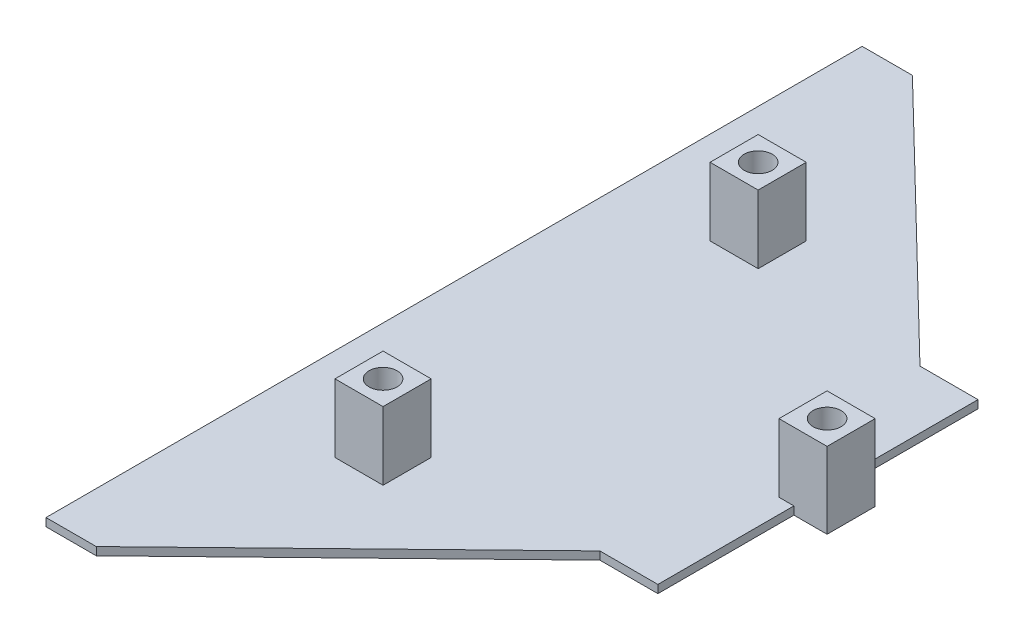
ISO-10303-21;
HEADER;
FILE_DESCRIPTION(('STEP AP214'),'2;1');
FILE_NAME('part.step','',(''),(''),'','','');
FILE_SCHEMA(('AUTOMOTIVE_DESIGN { 1 0 10303 214 1 1 1 1 }'));
ENDSEC;
DATA;
#1=APPLICATION_CONTEXT('core data for automotive mechanical design processes');
#2=APPLICATION_PROTOCOL_DEFINITION('international standard','automotive_design',2000,#1);
#3=PRODUCT_CONTEXT('',#1,'mechanical');
#4=PRODUCT('Part','Part','',(#3));
#5=PRODUCT_RELATED_PRODUCT_CATEGORY('part','',(#4));
#6=PRODUCT_DEFINITION_FORMATION('','',#4);
#7=PRODUCT_DEFINITION_CONTEXT('part definition',#1,'design');
#8=PRODUCT_DEFINITION('design','',#6,#7);
#9=PRODUCT_DEFINITION_SHAPE('','',#8);
#10=(LENGTH_UNIT() NAMED_UNIT(*) SI_UNIT(.MILLI.,.METRE.));
#11=(NAMED_UNIT(*) PLANE_ANGLE_UNIT() SI_UNIT($,.RADIAN.));
#12=(NAMED_UNIT(*) SI_UNIT($,.STERADIAN.) SOLID_ANGLE_UNIT());
#13=UNCERTAINTY_MEASURE_WITH_UNIT(LENGTH_MEASURE(1.E-05),#10,'distance_accuracy_value','');
#14=(GEOMETRIC_REPRESENTATION_CONTEXT(3) GLOBAL_UNCERTAINTY_ASSIGNED_CONTEXT((#13)) GLOBAL_UNIT_ASSIGNED_CONTEXT((#10,
#11,#12)) REPRESENTATION_CONTEXT('',''));
#15=CARTESIAN_POINT('',(0.,0.,0.));
#16=DIRECTION('',(0.,0.,1.));
#17=DIRECTION('',(1.,0.,0.));
#18=AXIS2_PLACEMENT_3D('',#15,#16,#17);
#19=CARTESIAN_POINT('',(45.4,1.,70.885));
#20=DIRECTION('',(-1.,0.,0.));
#21=DIRECTION('',(0.,0.,1.));
#22=AXIS2_PLACEMENT_3D('',#19,#20,#21);
#23=PLANE('',#22);
#24=DIRECTION('',(0.,1.,0.));
#25=VECTOR('',#24,1.);
#26=CARTESIAN_POINT('',(45.4,-7.28969135149082,47.915));
#27=LINE('',#26,#25);
#28=CARTESIAN_POINT('',(45.4,0.,47.915));
#29=VERTEX_POINT('',#28);
#30=CARTESIAN_POINT('',(45.4,1.,47.915));
#31=VERTEX_POINT('',#30);
#32=EDGE_CURVE('E183',#29,#31,#27,.T.);
#33=ORIENTED_EDGE('',*,*,#32,.F.);
#34=DIRECTION('',(0.,0.,-1.));
#35=VECTOR('',#34,1.);
#36=CARTESIAN_POINT('',(45.4,0.,70.885));
#37=LINE('',#36,#35);
#38=CARTESIAN_POINT('',(45.4,0.,30.945));
#39=VERTEX_POINT('',#38);
#40=EDGE_CURVE('E235',#29,#39,#37,.T.);
#41=ORIENTED_EDGE('',*,*,#40,.T.);
#42=DIRECTION('',(0.,-1.,0.));
#43=VECTOR('',#42,1.);
#44=CARTESIAN_POINT('',(45.4,1.,30.945));
#45=LINE('',#44,#43);
#46=CARTESIAN_POINT('',(45.4,1.,30.945));
#47=VERTEX_POINT('',#46);
#48=EDGE_CURVE('E202',#47,#39,#45,.T.);
#49=ORIENTED_EDGE('',*,*,#48,.F.);
#50=DIRECTION('',(0.,0.,-1.));
#51=VECTOR('',#50,1.);
#52=CARTESIAN_POINT('',(45.4,1.,70.885));
#53=LINE('',#52,#51);
#54=EDGE_CURVE('E203',#31,#47,#53,.T.);
#55=ORIENTED_EDGE('',*,*,#54,.F.);
#56=EDGE_LOOP('',(#33,#41,#49,#55));
#57=FACE_BOUND('',#56,.T.);
#58=ADVANCED_FACE('F39',(#57),#23,.F.);
#59=CARTESIAN_POINT('',(0.,1.,0.));
#60=DIRECTION('',(0.,1.,0.));
#61=DIRECTION('',(0.,0.,1.));
#62=AXIS2_PLACEMENT_3D('',#59,#60,#61);
#63=PLANE('',#62);
#64=CARTESIAN_POINT('',(46.54,1.,50.915));
#65=DIRECTION('',(0.,1.,0.));
#66=DIRECTION('',(0.,0.,1.));
#67=AXIS2_PLACEMENT_3D('',#64,#65,#66);
#68=CIRCLE('',#67,1.75);
#69=CARTESIAN_POINT('',(46.54,1.,52.665));
#70=VERTEX_POINT('',#69);
#71=EDGE_CURVE('E295',#70,#70,#68,.T.);
#72=ORIENTED_EDGE('',*,*,#71,.T.);
#73=EDGE_LOOP('',(#72));
#74=FACE_BOUND('',#73,.T.);
#75=ADVANCED_FACE('F429',(#74),#63,.T.);
#76=CARTESIAN_POINT('',(6.27,1.,0.));
#77=DIRECTION('',(0.,0.,1.));
#78=DIRECTION('',(1.,0.,0.));
#79=AXIS2_PLACEMENT_3D('',#76,#77,#78);
#80=PLANE('',#79);
#81=DIRECTION('',(-1.,0.,0.));
#82=VECTOR('',#81,1.);
#83=CARTESIAN_POINT('',(6.27,0.,0.));
#84=LINE('',#83,#82);
#85=CARTESIAN_POINT('',(6.27,0.,0.));
#86=VERTEX_POINT('',#85);
#87=CARTESIAN_POINT('',(0.,0.,0.));
#88=VERTEX_POINT('',#87);
#89=EDGE_CURVE('E219',#86,#88,#84,.T.);
#90=ORIENTED_EDGE('',*,*,#89,.T.);
#91=DIRECTION('',(0.,-1.,0.));
#92=VECTOR('',#91,1.);
#93=CARTESIAN_POINT('',(0.,1.,0.));
#94=LINE('',#93,#92);
#95=CARTESIAN_POINT('',(0.,1.,0.));
#96=VERTEX_POINT('',#95);
#97=EDGE_CURVE('E43',#96,#88,#94,.T.);
#98=ORIENTED_EDGE('',*,*,#97,.F.);
#99=DIRECTION('',(-1.,0.,0.));
#100=VECTOR('',#99,1.);
#101=CARTESIAN_POINT('',(6.27,1.,0.));
#102=LINE('',#101,#100);
#103=CARTESIAN_POINT('',(6.27,1.,0.));
#104=VERTEX_POINT('',#103);
#105=EDGE_CURVE('E238',#104,#96,#102,.T.);
#106=ORIENTED_EDGE('',*,*,#105,.F.);
#107=DIRECTION('',(0.,-1.,0.));
#108=VECTOR('',#107,1.);
#109=CARTESIAN_POINT('',(6.27,1.,0.));
#110=LINE('',#109,#108);
#111=EDGE_CURVE('E218',#104,#86,#110,.T.);
#112=ORIENTED_EDGE('',*,*,#111,.T.);
#113=EDGE_LOOP('',(#90,#98,#106,#112));
#114=FACE_BOUND('',#113,.T.);
#115=ADVANCED_FACE('F41',(#114),#80,.F.);
#116=CARTESIAN_POINT('',(0.,1.,0.));
#117=DIRECTION('',(1.,0.,0.));
#118=DIRECTION('',(0.,0.,-1.));
#119=AXIS2_PLACEMENT_3D('',#116,#117,#118);
#120=PLANE('',#119);
#121=DIRECTION('',(0.,0.,1.));
#122=VECTOR('',#121,1.);
#123=CARTESIAN_POINT('',(0.,0.,0.));
#124=LINE('',#123,#122);
#125=CARTESIAN_POINT('',(0.,0.,101.83));
#126=VERTEX_POINT('',#125);
#127=EDGE_CURVE('E224',#88,#126,#124,.T.);
#128=ORIENTED_EDGE('',*,*,#127,.T.);
#129=DIRECTION('',(0.,-1.,0.));
#130=VECTOR('',#129,1.);
#131=CARTESIAN_POINT('',(0.,1.,101.83));
#132=LINE('',#131,#130);
#133=CARTESIAN_POINT('',(0.,1.,101.83));
#134=VERTEX_POINT('',#133);
#135=EDGE_CURVE('E254',#134,#126,#132,.T.);
#136=ORIENTED_EDGE('',*,*,#135,.F.);
#137=DIRECTION('',(0.,0.,1.));
#138=VECTOR('',#137,1.);
#139=CARTESIAN_POINT('',(0.,1.,0.));
#140=LINE('',#139,#138);
#141=EDGE_CURVE('E264',#96,#134,#140,.T.);
#142=ORIENTED_EDGE('',*,*,#141,.F.);
#143=ORIENTED_EDGE('',*,*,#97,.T.);
#144=EDGE_LOOP('',(#128,#136,#142,#143));
#145=FACE_BOUND('',#144,.T.);
#146=ADVANCED_FACE('F262',(#145),#120,.F.);
#147=CARTESIAN_POINT('',(0.,1.,101.83));
#148=DIRECTION('',(0.,0.,-1.));
#149=DIRECTION('',(-1.,0.,0.));
#150=AXIS2_PLACEMENT_3D('',#147,#148,#149);
#151=PLANE('',#150);
#152=DIRECTION('',(1.,0.,0.));
#153=VECTOR('',#152,1.);
#154=CARTESIAN_POINT('',(0.,0.,101.83));
#155=LINE('',#154,#153);
#156=CARTESIAN_POINT('',(6.27,0.,101.83));
#157=VERTEX_POINT('',#156);
#158=EDGE_CURVE('E228',#126,#157,#155,.T.);
#159=ORIENTED_EDGE('',*,*,#158,.T.);
#160=DIRECTION('',(0.,-1.,0.));
#161=VECTOR('',#160,1.);
#162=CARTESIAN_POINT('',(6.27,1.,101.83));
#163=LINE('',#162,#161);
#164=CARTESIAN_POINT('',(6.27,1.,101.83));
#165=VERTEX_POINT('',#164);
#166=EDGE_CURVE('E251',#165,#157,#163,.T.);
#167=ORIENTED_EDGE('',*,*,#166,.F.);
#168=DIRECTION('',(1.,0.,0.));
#169=VECTOR('',#168,1.);
#170=CARTESIAN_POINT('',(0.,1.,101.83));
#171=LINE('',#170,#169);
#172=EDGE_CURVE('E284',#134,#165,#171,.T.);
#173=ORIENTED_EDGE('',*,*,#172,.F.);
#174=ORIENTED_EDGE('',*,*,#135,.T.);
#175=EDGE_LOOP('',(#159,#167,#173,#174));
#176=FACE_BOUND('',#175,.T.);
#177=ADVANCED_FACE('F279',(#176),#151,.F.);
#178=CARTESIAN_POINT('',(6.27,1.,101.83));
#179=DIRECTION('',(-0.696393575510658,0.,-0.717660078301337));
#180=DIRECTION('',(-0.717660078301337,0.,0.696393575510658));
#181=AXIS2_PLACEMENT_3D('',#178,#179,#180);
#182=PLANE('',#181);
#183=DIRECTION('',(0.717660078301337,0.,-0.696393575510658));
#184=VECTOR('',#183,1.);
#185=CARTESIAN_POINT('',(6.27,0.,101.83));
#186=LINE('',#185,#184);
#187=CARTESIAN_POINT('',(38.16,0.,70.885));
#188=VERTEX_POINT('',#187);
#189=EDGE_CURVE('E226',#157,#188,#186,.T.);
#190=ORIENTED_EDGE('',*,*,#189,.T.);
#191=DIRECTION('',(0.,-1.,0.));
#192=VECTOR('',#191,1.);
#193=CARTESIAN_POINT('',(38.16,1.,70.885));
#194=LINE('',#193,#192);
#195=CARTESIAN_POINT('',(38.16,1.,70.885));
#196=VERTEX_POINT('',#195);
#197=EDGE_CURVE('E247',#196,#188,#194,.T.);
#198=ORIENTED_EDGE('',*,*,#197,.F.);
#199=DIRECTION('',(0.717660078301337,0.,-0.696393575510658));
#200=VECTOR('',#199,1.);
#201=CARTESIAN_POINT('',(6.27,1.,101.83));
#202=LINE('',#201,#200);
#203=EDGE_CURVE('E215',#165,#196,#202,.T.);
#204=ORIENTED_EDGE('',*,*,#203,.F.);
#205=ORIENTED_EDGE('',*,*,#166,.T.);
#206=EDGE_LOOP('',(#190,#198,#204,#205));
#207=FACE_BOUND('',#206,.T.);
#208=ADVANCED_FACE('F283',(#207),#182,.F.);
#209=CARTESIAN_POINT('',(38.16,1.,70.885));
#210=DIRECTION('',(0.,0.,-1.));
#211=DIRECTION('',(-1.,0.,0.));
#212=AXIS2_PLACEMENT_3D('',#209,#210,#211);
#213=PLANE('',#212);
#214=DIRECTION('',(1.,0.,0.));
#215=VECTOR('',#214,1.);
#216=CARTESIAN_POINT('',(38.16,0.,70.885));
#217=LINE('',#216,#215);
#218=CARTESIAN_POINT('',(45.4,0.,70.885));
#219=VERTEX_POINT('',#218);
#220=EDGE_CURVE('E227',#188,#219,#217,.T.);
#221=ORIENTED_EDGE('',*,*,#220,.T.);
#222=DIRECTION('',(0.,-1.,0.));
#223=VECTOR('',#222,1.);
#224=CARTESIAN_POINT('',(45.4,1.,70.885));
#225=LINE('',#224,#223);
#226=CARTESIAN_POINT('',(45.4,1.,70.885));
#227=VERTEX_POINT('',#226);
#228=EDGE_CURVE('E250',#227,#219,#225,.T.);
#229=ORIENTED_EDGE('',*,*,#228,.F.);
#230=DIRECTION('',(1.,0.,0.));
#231=VECTOR('',#230,1.);
#232=CARTESIAN_POINT('',(38.16,1.,70.885));
#233=LINE('',#232,#231);
#234=EDGE_CURVE('E208',#196,#227,#233,.T.);
#235=ORIENTED_EDGE('',*,*,#234,.F.);
#236=ORIENTED_EDGE('',*,*,#197,.T.);
#237=EDGE_LOOP('',(#221,#229,#235,#236));
#238=FACE_BOUND('',#237,.T.);
#239=ADVANCED_FACE('F416',(#238),#213,.F.);
#240=CARTESIAN_POINT('',(45.4,0.,53.915));
#241=VERTEX_POINT('',#240);
#242=EDGE_CURVE('E231',#219,#241,#37,.T.);
#243=ORIENTED_EDGE('',*,*,#242,.T.);
#244=DIRECTION('',(0.,1.,0.));
#245=VECTOR('',#244,1.);
#246=CARTESIAN_POINT('',(45.4,-7.28969135149082,53.915));
#247=LINE('',#246,#245);
#248=CARTESIAN_POINT('',(45.4,1.,53.915));
#249=VERTEX_POINT('',#248);
#250=EDGE_CURVE('E192',#241,#249,#247,.T.);
#251=ORIENTED_EDGE('',*,*,#250,.T.);
#252=EDGE_CURVE('E210',#227,#249,#53,.T.);
#253=ORIENTED_EDGE('',*,*,#252,.F.);
#254=ORIENTED_EDGE('',*,*,#228,.T.);
#255=EDGE_LOOP('',(#243,#251,#253,#254));
#256=FACE_BOUND('',#255,.T.);
#257=ADVANCED_FACE('F418',(#256),#23,.F.);
#258=CARTESIAN_POINT('',(45.4,1.,30.945));
#259=DIRECTION('',(0.,0.,1.));
#260=DIRECTION('',(1.,0.,0.));
#261=AXIS2_PLACEMENT_3D('',#258,#259,#260);
#262=PLANE('',#261);
#263=DIRECTION('',(-1.,0.,0.));
#264=VECTOR('',#263,1.);
#265=CARTESIAN_POINT('',(45.4,0.,30.945));
#266=LINE('',#265,#264);
#267=CARTESIAN_POINT('',(38.16,0.,30.945));
#268=VERTEX_POINT('',#267);
#269=EDGE_CURVE('E237',#39,#268,#266,.T.);
#270=ORIENTED_EDGE('',*,*,#269,.T.);
#271=DIRECTION('',(0.,-1.,0.));
#272=VECTOR('',#271,1.);
#273=CARTESIAN_POINT('',(38.16,1.,30.945));
#274=LINE('',#273,#272);
#275=CARTESIAN_POINT('',(38.16,1.,30.945));
#276=VERTEX_POINT('',#275);
#277=EDGE_CURVE('E241',#276,#268,#274,.T.);
#278=ORIENTED_EDGE('',*,*,#277,.F.);
#279=DIRECTION('',(-1.,0.,0.));
#280=VECTOR('',#279,1.);
#281=CARTESIAN_POINT('',(45.4,1.,30.945));
#282=LINE('',#281,#280);
#283=EDGE_CURVE('E211',#47,#276,#282,.T.);
#284=ORIENTED_EDGE('',*,*,#283,.F.);
#285=ORIENTED_EDGE('',*,*,#48,.T.);
#286=EDGE_LOOP('',(#270,#278,#284,#285));
#287=FACE_BOUND('',#286,.T.);
#288=ADVANCED_FACE('F426',(#287),#262,.F.);
#289=CARTESIAN_POINT('',(38.16,1.,30.945));
#290=DIRECTION('',(-0.696393575510658,0.,0.717660078301337));
#291=DIRECTION('',(0.717660078301337,0.,0.696393575510658));
#292=AXIS2_PLACEMENT_3D('',#289,#290,#291);
#293=PLANE('',#292);
#294=DIRECTION('',(-0.717660078301337,0.,-0.696393575510658));
#295=VECTOR('',#294,1.);
#296=CARTESIAN_POINT('',(38.16,0.,30.945));
#297=LINE('',#296,#295);
#298=EDGE_CURVE('E236',#268,#86,#297,.T.);
#299=ORIENTED_EDGE('',*,*,#298,.T.);
#300=ORIENTED_EDGE('',*,*,#111,.F.);
#301=DIRECTION('',(-0.717660078301337,0.,-0.696393575510658));
#302=VECTOR('',#301,1.);
#303=CARTESIAN_POINT('',(38.16,1.,30.945));
#304=LINE('',#303,#302);
#305=EDGE_CURVE('E220',#276,#104,#304,.T.);
#306=ORIENTED_EDGE('',*,*,#305,.F.);
#307=ORIENTED_EDGE('',*,*,#277,.T.);
#308=EDGE_LOOP('',(#299,#300,#306,#307));
#309=FACE_BOUND('',#308,.T.);
#310=ADVANCED_FACE('F439',(#309),#293,.F.);
#311=DIRECTION('',(0.,0.,-1.));
#312=VECTOR('',#311,1.);
#313=CARTESIAN_POINT('',(17.54,1.,24.515));
#314=LINE('',#313,#312);
#315=CARTESIAN_POINT('',(17.54,1.,30.515));
#316=VERTEX_POINT('',#315);
#317=CARTESIAN_POINT('',(17.54,1.,24.515));
#318=VERTEX_POINT('',#317);
#319=EDGE_CURVE('E54',#316,#318,#314,.T.);
#320=ORIENTED_EDGE('',*,*,#319,.F.);
#321=DIRECTION('',(1.,0.,0.));
#322=VECTOR('',#321,1.);
#323=CARTESIAN_POINT('',(11.54,1.,30.515));
#324=LINE('',#323,#322);
#325=CARTESIAN_POINT('',(11.54,1.,30.515));
#326=VERTEX_POINT('',#325);
#327=EDGE_CURVE('E56',#326,#316,#324,.T.);
#328=ORIENTED_EDGE('',*,*,#327,.F.);
#329=DIRECTION('',(0.,0.,1.));
#330=VECTOR('',#329,1.);
#331=CARTESIAN_POINT('',(11.54,1.,24.515));
#332=LINE('',#331,#330);
#333=CARTESIAN_POINT('',(11.54,1.,24.515));
#334=VERTEX_POINT('',#333);
#335=EDGE_CURVE('E375',#334,#326,#332,.T.);
#336=ORIENTED_EDGE('',*,*,#335,.F.);
#337=DIRECTION('',(-1.,0.,0.));
#338=VECTOR('',#337,1.);
#339=CARTESIAN_POINT('',(11.54,1.,24.515));
#340=LINE('',#339,#338);
#341=EDGE_CURVE('E372',#318,#334,#340,.T.);
#342=ORIENTED_EDGE('',*,*,#341,.F.);
#343=EDGE_LOOP('',(#320,#328,#336,#342));
#344=FACE_BOUND('',#343,.T.);
#345=DIRECTION('',(0.,0.,-1.));
#346=VECTOR('',#345,1.);
#347=CARTESIAN_POINT('',(17.54,1.,71.315));
#348=LINE('',#347,#346);
#349=CARTESIAN_POINT('',(17.54,1.,77.315));
#350=VERTEX_POINT('',#349);
#351=CARTESIAN_POINT('',(17.54,1.,71.315));
#352=VERTEX_POINT('',#351);
#353=EDGE_CURVE('E323',#350,#352,#348,.T.);
#354=ORIENTED_EDGE('',*,*,#353,.F.);
#355=DIRECTION('',(1.,0.,0.));
#356=VECTOR('',#355,1.);
#357=CARTESIAN_POINT('',(11.54,1.,77.315));
#358=LINE('',#357,#356);
#359=CARTESIAN_POINT('',(11.54,1.,77.315));
#360=VERTEX_POINT('',#359);
#361=EDGE_CURVE('E329',#360,#350,#358,.T.);
#362=ORIENTED_EDGE('',*,*,#361,.F.);
#363=DIRECTION('',(0.,0.,1.));
#364=VECTOR('',#363,1.);
#365=CARTESIAN_POINT('',(11.54,1.,71.315));
#366=LINE('',#365,#364);
#367=CARTESIAN_POINT('',(11.54,1.,71.315));
#368=VERTEX_POINT('',#367);
#369=EDGE_CURVE('E341',#368,#360,#366,.T.);
#370=ORIENTED_EDGE('',*,*,#369,.F.);
#371=DIRECTION('',(-1.,0.,0.));
#372=VECTOR('',#371,1.);
#373=CARTESIAN_POINT('',(11.54,1.,71.315));
#374=LINE('',#373,#372);
#375=EDGE_CURVE('E337',#352,#368,#374,.T.);
#376=ORIENTED_EDGE('',*,*,#375,.F.);
#377=EDGE_LOOP('',(#354,#362,#370,#376));
#378=FACE_BOUND('',#377,.T.);
#379=DIRECTION('',(1.,0.,0.));
#380=VECTOR('',#379,1.);
#381=CARTESIAN_POINT('',(43.54,1.,53.915));
#382=LINE('',#381,#380);
#383=CARTESIAN_POINT('',(43.54,1.,53.915));
#384=VERTEX_POINT('',#383);
#385=EDGE_CURVE('E299',#384,#249,#382,.T.);
#386=ORIENTED_EDGE('',*,*,#385,.F.);
#387=DIRECTION('',(0.,0.,1.));
#388=VECTOR('',#387,1.);
#389=CARTESIAN_POINT('',(43.54,1.,47.915));
#390=LINE('',#389,#388);
#391=CARTESIAN_POINT('',(43.54,1.,47.915));
#392=VERTEX_POINT('',#391);
#393=EDGE_CURVE('E201',#392,#384,#390,.T.);
#394=ORIENTED_EDGE('',*,*,#393,.F.);
#395=DIRECTION('',(-1.,0.,0.));
#396=VECTOR('',#395,1.);
#397=CARTESIAN_POINT('',(43.54,1.,47.915));
#398=LINE('',#397,#396);
#399=EDGE_CURVE('E11',#31,#392,#398,.T.);
#400=ORIENTED_EDGE('',*,*,#399,.F.);
#401=ORIENTED_EDGE('',*,*,#54,.T.);
#402=ORIENTED_EDGE('',*,*,#283,.T.);
#403=ORIENTED_EDGE('',*,*,#305,.T.);
#404=ORIENTED_EDGE('',*,*,#105,.T.);
#405=ORIENTED_EDGE('',*,*,#141,.T.);
#406=ORIENTED_EDGE('',*,*,#172,.T.);
#407=ORIENTED_EDGE('',*,*,#203,.T.);
#408=ORIENTED_EDGE('',*,*,#234,.T.);
#409=ORIENTED_EDGE('',*,*,#252,.T.);
#410=EDGE_LOOP('',(#386,#394,#400,#401,#402,#403,#404,#405,#406,#407,#408,#409));
#411=FACE_BOUND('',#410,.T.);
#412=ADVANCED_FACE('F199',(#344,#378,#411),#63,.T.);
#413=CARTESIAN_POINT('',(0.,0.,0.));
#414=DIRECTION('',(0.,1.,0.));
#415=DIRECTION('',(0.,0.,1.));
#416=AXIS2_PLACEMENT_3D('',#413,#414,#415);
#417=PLANE('',#416);
#418=ORIENTED_EDGE('',*,*,#89,.F.);
#419=ORIENTED_EDGE('',*,*,#298,.F.);
#420=ORIENTED_EDGE('',*,*,#269,.F.);
#421=ORIENTED_EDGE('',*,*,#40,.F.);
#422=DIRECTION('',(-1.,0.,0.));
#423=VECTOR('',#422,1.);
#424=CARTESIAN_POINT('',(49.54,0.,47.915));
#425=LINE('',#424,#423);
#426=CARTESIAN_POINT('',(49.54,0.,47.915));
#427=VERTEX_POINT('',#426);
#428=EDGE_CURVE('E193',#427,#29,#425,.T.);
#429=ORIENTED_EDGE('',*,*,#428,.F.);
#430=DIRECTION('',(0.,0.,-1.));
#431=VECTOR('',#430,1.);
#432=CARTESIAN_POINT('',(49.54,0.,47.915));
#433=LINE('',#432,#431);
#434=CARTESIAN_POINT('',(49.54,0.,53.915));
#435=VERTEX_POINT('',#434);
#436=EDGE_CURVE('E318',#435,#427,#433,.T.);
#437=ORIENTED_EDGE('',*,*,#436,.F.);
#438=DIRECTION('',(1.,0.,0.));
#439=VECTOR('',#438,1.);
#440=CARTESIAN_POINT('',(49.54,0.,53.915));
#441=LINE('',#440,#439);
#442=EDGE_CURVE('E393',#241,#435,#441,.T.);
#443=ORIENTED_EDGE('',*,*,#442,.F.);
#444=ORIENTED_EDGE('',*,*,#242,.F.);
#445=ORIENTED_EDGE('',*,*,#220,.F.);
#446=ORIENTED_EDGE('',*,*,#189,.F.);
#447=ORIENTED_EDGE('',*,*,#158,.F.);
#448=ORIENTED_EDGE('',*,*,#127,.F.);
#449=EDGE_LOOP('',(#418,#419,#420,#421,#429,#437,#443,#444,#445,#446,#447,#448));
#450=FACE_BOUND('',#449,.T.);
#451=ADVANCED_FACE('F272',(#450),#417,.F.);
#452=CARTESIAN_POINT('',(0.,9.5,0.));
#453=DIRECTION('',(0.,1.,0.));
#454=DIRECTION('',(0.,0.,1.));
#455=AXIS2_PLACEMENT_3D('',#452,#453,#454);
#456=PLANE('',#455);
#457=DIRECTION('',(0.,0.,-1.));
#458=VECTOR('',#457,1.);
#459=CARTESIAN_POINT('',(49.54,9.5,47.915));
#460=LINE('',#459,#458);
#461=CARTESIAN_POINT('',(49.54,9.5,53.915));
#462=VERTEX_POINT('',#461);
#463=CARTESIAN_POINT('',(49.54,9.5,47.915));
#464=VERTEX_POINT('',#463);
#465=EDGE_CURVE('E298',#462,#464,#460,.T.);
#466=ORIENTED_EDGE('',*,*,#465,.T.);
#467=DIRECTION('',(-1.,0.,0.));
#468=VECTOR('',#467,1.);
#469=CARTESIAN_POINT('',(43.54,9.5,47.915));
#470=LINE('',#469,#468);
#471=CARTESIAN_POINT('',(43.54,9.5,47.915));
#472=VERTEX_POINT('',#471);
#473=EDGE_CURVE('E297',#464,#472,#470,.T.);
#474=ORIENTED_EDGE('',*,*,#473,.T.);
#475=DIRECTION('',(0.,0.,1.));
#476=VECTOR('',#475,1.);
#477=CARTESIAN_POINT('',(43.54,9.5,47.915));
#478=LINE('',#477,#476);
#479=CARTESIAN_POINT('',(43.54,9.5,53.915));
#480=VERTEX_POINT('',#479);
#481=EDGE_CURVE('E305',#472,#480,#478,.T.);
#482=ORIENTED_EDGE('',*,*,#481,.T.);
#483=DIRECTION('',(1.,0.,0.));
#484=VECTOR('',#483,1.);
#485=CARTESIAN_POINT('',(43.54,9.5,53.915));
#486=LINE('',#485,#484);
#487=EDGE_CURVE('E304',#480,#462,#486,.T.);
#488=ORIENTED_EDGE('',*,*,#487,.T.);
#489=EDGE_LOOP('',(#466,#474,#482,#488));
#490=FACE_BOUND('',#489,.T.);
#491=CARTESIAN_POINT('',(46.54,9.5,50.915));
#492=DIRECTION('',(0.,1.,0.));
#493=DIRECTION('',(0.,0.,1.));
#494=AXIS2_PLACEMENT_3D('',#491,#492,#493);
#495=CIRCLE('',#494,1.75);
#496=CARTESIAN_POINT('',(46.54,9.5,52.665));
#497=VERTEX_POINT('',#496);
#498=EDGE_CURVE('E289',#497,#497,#495,.T.);
#499=ORIENTED_EDGE('',*,*,#498,.F.);
#500=EDGE_LOOP('',(#499));
#501=FACE_BOUND('',#500,.T.);
#502=ADVANCED_FACE('F406',(#490,#501),#456,.T.);
#503=CARTESIAN_POINT('',(49.54,9.5,47.915));
#504=DIRECTION('',(-1.,0.,0.));
#505=DIRECTION('',(0.,0.,1.));
#506=AXIS2_PLACEMENT_3D('',#503,#504,#505);
#507=PLANE('',#506);
#508=DIRECTION('',(0.,-1.,0.));
#509=VECTOR('',#508,1.);
#510=CARTESIAN_POINT('',(49.54,9.5,53.915));
#511=LINE('',#510,#509);
#512=EDGE_CURVE('E302',#462,#435,#511,.T.);
#513=ORIENTED_EDGE('',*,*,#512,.T.);
#514=ORIENTED_EDGE('',*,*,#436,.T.);
#515=DIRECTION('',(0.,-1.,0.));
#516=VECTOR('',#515,1.);
#517=CARTESIAN_POINT('',(49.54,9.5,47.915));
#518=LINE('',#517,#516);
#519=EDGE_CURVE('E316',#464,#427,#518,.T.);
#520=ORIENTED_EDGE('',*,*,#519,.F.);
#521=ORIENTED_EDGE('',*,*,#465,.F.);
#522=EDGE_LOOP('',(#513,#514,#520,#521));
#523=FACE_BOUND('',#522,.T.);
#524=ADVANCED_FACE('F408',(#523),#507,.F.);
#525=CARTESIAN_POINT('',(43.54,9.5,47.915));
#526=DIRECTION('',(0.,0.,1.));
#527=DIRECTION('',(1.,0.,0.));
#528=AXIS2_PLACEMENT_3D('',#525,#526,#527);
#529=PLANE('',#528);
#530=ORIENTED_EDGE('',*,*,#519,.T.);
#531=ORIENTED_EDGE('',*,*,#428,.T.);
#532=ORIENTED_EDGE('',*,*,#32,.T.);
#533=ORIENTED_EDGE('',*,*,#399,.T.);
#534=DIRECTION('',(0.,-1.,0.));
#535=VECTOR('',#534,1.);
#536=CARTESIAN_POINT('',(43.54,9.5,47.915));
#537=LINE('',#536,#535);
#538=EDGE_CURVE('E314',#472,#392,#537,.T.);
#539=ORIENTED_EDGE('',*,*,#538,.F.);
#540=ORIENTED_EDGE('',*,*,#473,.F.);
#541=EDGE_LOOP('',(#530,#531,#532,#533,#539,#540));
#542=FACE_BOUND('',#541,.T.);
#543=ADVANCED_FACE('F190',(#542),#529,.F.);
#544=CARTESIAN_POINT('',(43.54,9.5,47.915));
#545=DIRECTION('',(1.,0.,0.));
#546=DIRECTION('',(0.,0.,-1.));
#547=AXIS2_PLACEMENT_3D('',#544,#545,#546);
#548=PLANE('',#547);
#549=ORIENTED_EDGE('',*,*,#393,.T.);
#550=DIRECTION('',(0.,-1.,0.));
#551=VECTOR('',#550,1.);
#552=CARTESIAN_POINT('',(43.54,9.5,53.915));
#553=LINE('',#552,#551);
#554=EDGE_CURVE('E313',#480,#384,#553,.T.);
#555=ORIENTED_EDGE('',*,*,#554,.F.);
#556=ORIENTED_EDGE('',*,*,#481,.F.);
#557=ORIENTED_EDGE('',*,*,#538,.T.);
#558=EDGE_LOOP('',(#549,#555,#556,#557));
#559=FACE_BOUND('',#558,.T.);
#560=ADVANCED_FACE('F456',(#559),#548,.F.);
#561=CARTESIAN_POINT('',(43.54,9.5,53.915));
#562=DIRECTION('',(0.,0.,-1.));
#563=DIRECTION('',(-1.,0.,0.));
#564=AXIS2_PLACEMENT_3D('',#561,#562,#563);
#565=PLANE('',#564);
#566=ORIENTED_EDGE('',*,*,#385,.T.);
#567=ORIENTED_EDGE('',*,*,#250,.F.);
#568=ORIENTED_EDGE('',*,*,#442,.T.);
#569=ORIENTED_EDGE('',*,*,#512,.F.);
#570=ORIENTED_EDGE('',*,*,#487,.F.);
#571=ORIENTED_EDGE('',*,*,#554,.T.);
#572=EDGE_LOOP('',(#566,#567,#568,#569,#570,#571));
#573=FACE_BOUND('',#572,.T.);
#574=ADVANCED_FACE('F399',(#573),#565,.F.);
#575=CARTESIAN_POINT('',(46.54,9.5,50.915));
#576=DIRECTION('',(0.,-1.,0.));
#577=DIRECTION('',(0.,0.,-1.));
#578=AXIS2_PLACEMENT_3D('',#575,#576,#577);
#579=CYLINDRICAL_SURFACE('',#578,1.75);
#580=ORIENTED_EDGE('',*,*,#498,.T.);
#581=EDGE_LOOP('',(#580));
#582=FACE_BOUND('',#581,.T.);
#583=ORIENTED_EDGE('',*,*,#71,.F.);
#584=EDGE_LOOP('',(#583));
#585=FACE_BOUND('',#584,.T.);
#586=ADVANCED_FACE('F449',(#582,#585),#579,.F.);
#587=CARTESIAN_POINT('',(0.,9.5,0.));
#588=DIRECTION('',(0.,1.,0.));
#589=DIRECTION('',(0.,0.,1.));
#590=AXIS2_PLACEMENT_3D('',#587,#588,#589);
#591=PLANE('',#590);
#592=DIRECTION('',(0.,0.,-1.));
#593=VECTOR('',#592,1.);
#594=CARTESIAN_POINT('',(17.54,9.5,71.315));
#595=LINE('',#594,#593);
#596=CARTESIAN_POINT('',(17.54,9.5,77.315));
#597=VERTEX_POINT('',#596);
#598=CARTESIAN_POINT('',(17.54,9.5,71.315));
#599=VERTEX_POINT('',#598);
#600=EDGE_CURVE('E330',#597,#599,#595,.T.);
#601=ORIENTED_EDGE('',*,*,#600,.T.);
#602=DIRECTION('',(-1.,0.,0.));
#603=VECTOR('',#602,1.);
#604=CARTESIAN_POINT('',(11.54,9.5,71.315));
#605=LINE('',#604,#603);
#606=CARTESIAN_POINT('',(11.54,9.5,71.315));
#607=VERTEX_POINT('',#606);
#608=EDGE_CURVE('E332',#599,#607,#605,.T.);
#609=ORIENTED_EDGE('',*,*,#608,.T.);
#610=DIRECTION('',(0.,0.,1.));
#611=VECTOR('',#610,1.);
#612=CARTESIAN_POINT('',(11.54,9.5,71.315));
#613=LINE('',#612,#611);
#614=CARTESIAN_POINT('',(11.54,9.5,77.315));
#615=VERTEX_POINT('',#614);
#616=EDGE_CURVE('E334',#607,#615,#613,.T.);
#617=ORIENTED_EDGE('',*,*,#616,.T.);
#618=DIRECTION('',(1.,0.,0.));
#619=VECTOR('',#618,1.);
#620=CARTESIAN_POINT('',(11.54,9.5,77.315));
#621=LINE('',#620,#619);
#622=EDGE_CURVE('E333',#615,#597,#621,.T.);
#623=ORIENTED_EDGE('',*,*,#622,.T.);
#624=EDGE_LOOP('',(#601,#609,#617,#623));
#625=FACE_BOUND('',#624,.T.);
#626=CARTESIAN_POINT('',(14.54,9.5,74.315));
#627=DIRECTION('',(0.,1.,0.));
#628=DIRECTION('',(0.,0.,1.));
#629=AXIS2_PLACEMENT_3D('',#626,#627,#628);
#630=CIRCLE('',#629,1.75);
#631=CARTESIAN_POINT('',(14.54,9.5,76.065));
#632=VERTEX_POINT('',#631);
#633=EDGE_CURVE('E317',#632,#632,#630,.T.);
#634=ORIENTED_EDGE('',*,*,#633,.F.);
#635=EDGE_LOOP('',(#634));
#636=FACE_BOUND('',#635,.T.);
#637=ADVANCED_FACE('F455',(#625,#636),#591,.T.);
#638=CARTESIAN_POINT('',(17.54,9.5,71.315));
#639=DIRECTION('',(-1.,0.,0.));
#640=DIRECTION('',(0.,0.,1.));
#641=AXIS2_PLACEMENT_3D('',#638,#639,#640);
#642=PLANE('',#641);
#643=ORIENTED_EDGE('',*,*,#353,.T.);
#644=DIRECTION('',(0.,-1.,0.));
#645=VECTOR('',#644,1.);
#646=CARTESIAN_POINT('',(17.54,9.5,71.315));
#647=LINE('',#646,#645);
#648=EDGE_CURVE('E293',#599,#352,#647,.T.);
#649=ORIENTED_EDGE('',*,*,#648,.F.);
#650=ORIENTED_EDGE('',*,*,#600,.F.);
#651=DIRECTION('',(0.,-1.,0.));
#652=VECTOR('',#651,1.);
#653=CARTESIAN_POINT('',(17.54,9.5,77.315));
#654=LINE('',#653,#652);
#655=EDGE_CURVE('E340',#597,#350,#654,.T.);
#656=ORIENTED_EDGE('',*,*,#655,.T.);
#657=EDGE_LOOP('',(#643,#649,#650,#656));
#658=FACE_BOUND('',#657,.T.);
#659=ADVANCED_FACE('F471',(#658),#642,.F.);
#660=CARTESIAN_POINT('',(11.54,9.5,71.315));
#661=DIRECTION('',(0.,0.,1.));
#662=DIRECTION('',(1.,0.,0.));
#663=AXIS2_PLACEMENT_3D('',#660,#661,#662);
#664=PLANE('',#663);
#665=ORIENTED_EDGE('',*,*,#375,.T.);
#666=DIRECTION('',(0.,-1.,0.));
#667=VECTOR('',#666,1.);
#668=CARTESIAN_POINT('',(11.54,9.5,71.315));
#669=LINE('',#668,#667);
#670=EDGE_CURVE('E351',#607,#368,#669,.T.);
#671=ORIENTED_EDGE('',*,*,#670,.F.);
#672=ORIENTED_EDGE('',*,*,#608,.F.);
#673=ORIENTED_EDGE('',*,*,#648,.T.);
#674=EDGE_LOOP('',(#665,#671,#672,#673));
#675=FACE_BOUND('',#674,.T.);
#676=ADVANCED_FACE('F481',(#675),#664,.F.);
#677=CARTESIAN_POINT('',(11.54,9.5,71.315));
#678=DIRECTION('',(1.,0.,0.));
#679=DIRECTION('',(0.,0.,-1.));
#680=AXIS2_PLACEMENT_3D('',#677,#678,#679);
#681=PLANE('',#680);
#682=ORIENTED_EDGE('',*,*,#369,.T.);
#683=DIRECTION('',(0.,-1.,0.));
#684=VECTOR('',#683,1.);
#685=CARTESIAN_POINT('',(11.54,9.5,77.315));
#686=LINE('',#685,#684);
#687=EDGE_CURVE('E348',#615,#360,#686,.T.);
#688=ORIENTED_EDGE('',*,*,#687,.F.);
#689=ORIENTED_EDGE('',*,*,#616,.F.);
#690=ORIENTED_EDGE('',*,*,#670,.T.);
#691=EDGE_LOOP('',(#682,#688,#689,#690));
#692=FACE_BOUND('',#691,.T.);
#693=ADVANCED_FACE('F480',(#692),#681,.F.);
#694=CARTESIAN_POINT('',(11.54,9.5,77.315));
#695=DIRECTION('',(0.,0.,-1.));
#696=DIRECTION('',(-1.,0.,0.));
#697=AXIS2_PLACEMENT_3D('',#694,#695,#696);
#698=PLANE('',#697);
#699=ORIENTED_EDGE('',*,*,#361,.T.);
#700=ORIENTED_EDGE('',*,*,#655,.F.);
#701=ORIENTED_EDGE('',*,*,#622,.F.);
#702=ORIENTED_EDGE('',*,*,#687,.T.);
#703=EDGE_LOOP('',(#699,#700,#701,#702));
#704=FACE_BOUND('',#703,.T.);
#705=ADVANCED_FACE('F469',(#704),#698,.F.);
#706=CARTESIAN_POINT('',(14.54,9.5,74.315));
#707=DIRECTION('',(0.,-1.,0.));
#708=DIRECTION('',(0.,0.,-1.));
#709=AXIS2_PLACEMENT_3D('',#706,#707,#708);
#710=CYLINDRICAL_SURFACE('',#709,1.75);
#711=ORIENTED_EDGE('',*,*,#633,.T.);
#712=EDGE_LOOP('',(#711));
#713=FACE_BOUND('',#712,.T.);
#714=CARTESIAN_POINT('',(14.54,1.,74.315));
#715=DIRECTION('',(0.,1.,0.));
#716=DIRECTION('',(0.,0.,1.));
#717=AXIS2_PLACEMENT_3D('',#714,#715,#716);
#718=CIRCLE('',#717,1.75);
#719=CARTESIAN_POINT('',(14.54,1.,76.065));
#720=VERTEX_POINT('',#719);
#721=EDGE_CURVE('E325',#720,#720,#718,.T.);
#722=ORIENTED_EDGE('',*,*,#721,.F.);
#723=EDGE_LOOP('',(#722));
#724=FACE_BOUND('',#723,.T.);
#725=ADVANCED_FACE('F462',(#713,#724),#710,.F.);
#726=CARTESIAN_POINT('',(0.,9.5,0.));
#727=DIRECTION('',(0.,1.,0.));
#728=DIRECTION('',(0.,0.,1.));
#729=AXIS2_PLACEMENT_3D('',#726,#727,#728);
#730=PLANE('',#729);
#731=DIRECTION('',(0.,0.,-1.));
#732=VECTOR('',#731,1.);
#733=CARTESIAN_POINT('',(17.54,9.5,24.515));
#734=LINE('',#733,#732);
#735=CARTESIAN_POINT('',(17.54,9.5,30.515));
#736=VERTEX_POINT('',#735);
#737=CARTESIAN_POINT('',(17.54,9.5,24.515));
#738=VERTEX_POINT('',#737);
#739=EDGE_CURVE('E371',#736,#738,#734,.T.);
#740=ORIENTED_EDGE('',*,*,#739,.T.);
#741=DIRECTION('',(-1.,0.,0.));
#742=VECTOR('',#741,1.);
#743=CARTESIAN_POINT('',(11.54,9.5,24.515));
#744=LINE('',#743,#742);
#745=CARTESIAN_POINT('',(11.54,9.5,24.515));
#746=VERTEX_POINT('',#745);
#747=EDGE_CURVE('E385',#738,#746,#744,.T.);
#748=ORIENTED_EDGE('',*,*,#747,.T.);
#749=DIRECTION('',(0.,0.,1.));
#750=VECTOR('',#749,1.);
#751=CARTESIAN_POINT('',(11.54,9.5,24.515));
#752=LINE('',#751,#750);
#753=CARTESIAN_POINT('',(11.54,9.5,30.515));
#754=VERTEX_POINT('',#753);
#755=EDGE_CURVE('E379',#746,#754,#752,.T.);
#756=ORIENTED_EDGE('',*,*,#755,.T.);
#757=DIRECTION('',(1.,0.,0.));
#758=VECTOR('',#757,1.);
#759=CARTESIAN_POINT('',(11.54,9.5,30.515));
#760=LINE('',#759,#758);
#761=EDGE_CURVE('E369',#754,#736,#760,.T.);
#762=ORIENTED_EDGE('',*,*,#761,.T.);
#763=EDGE_LOOP('',(#740,#748,#756,#762));
#764=FACE_BOUND('',#763,.T.);
#765=CARTESIAN_POINT('',(14.54,9.5,27.515));
#766=DIRECTION('',(0.,1.,0.));
#767=DIRECTION('',(0.,0.,1.));
#768=AXIS2_PLACEMENT_3D('',#765,#766,#767);
#769=CIRCLE('',#768,1.75);
#770=CARTESIAN_POINT('',(14.54,9.5,29.265));
#771=VERTEX_POINT('',#770);
#772=EDGE_CURVE('E378',#771,#771,#769,.T.);
#773=ORIENTED_EDGE('',*,*,#772,.F.);
#774=EDGE_LOOP('',(#773));
#775=FACE_BOUND('',#774,.T.);
#776=ADVANCED_FACE('F466',(#764,#775),#730,.T.);
#777=CARTESIAN_POINT('',(17.54,9.5,24.515));
#778=DIRECTION('',(-1.,0.,0.));
#779=DIRECTION('',(0.,0.,1.));
#780=AXIS2_PLACEMENT_3D('',#777,#778,#779);
#781=PLANE('',#780);
#782=ORIENTED_EDGE('',*,*,#319,.T.);
#783=DIRECTION('',(0.,-1.,0.));
#784=VECTOR('',#783,1.);
#785=CARTESIAN_POINT('',(17.54,9.5,24.515));
#786=LINE('',#785,#784);
#787=EDGE_CURVE('E221',#738,#318,#786,.T.);
#788=ORIENTED_EDGE('',*,*,#787,.F.);
#789=ORIENTED_EDGE('',*,*,#739,.F.);
#790=DIRECTION('',(0.,-1.,0.));
#791=VECTOR('',#790,1.);
#792=CARTESIAN_POINT('',(17.54,9.5,30.515));
#793=LINE('',#792,#791);
#794=EDGE_CURVE('E368',#736,#316,#793,.T.);
#795=ORIENTED_EDGE('',*,*,#794,.T.);
#796=EDGE_LOOP('',(#782,#788,#789,#795));
#797=FACE_BOUND('',#796,.T.);
#798=ADVANCED_FACE('F487',(#797),#781,.F.);
#799=CARTESIAN_POINT('',(11.54,9.5,24.515));
#800=DIRECTION('',(0.,0.,1.));
#801=DIRECTION('',(1.,0.,0.));
#802=AXIS2_PLACEMENT_3D('',#799,#800,#801);
#803=PLANE('',#802);
#804=ORIENTED_EDGE('',*,*,#341,.T.);
#805=DIRECTION('',(0.,-1.,0.));
#806=VECTOR('',#805,1.);
#807=CARTESIAN_POINT('',(11.54,9.5,24.515));
#808=LINE('',#807,#806);
#809=EDGE_CURVE('E357',#746,#334,#808,.T.);
#810=ORIENTED_EDGE('',*,*,#809,.F.);
#811=ORIENTED_EDGE('',*,*,#747,.F.);
#812=ORIENTED_EDGE('',*,*,#787,.T.);
#813=EDGE_LOOP('',(#804,#810,#811,#812));
#814=FACE_BOUND('',#813,.T.);
#815=ADVANCED_FACE('F495',(#814),#803,.F.);
#816=CARTESIAN_POINT('',(11.54,9.5,24.515));
#817=DIRECTION('',(1.,0.,0.));
#818=DIRECTION('',(0.,0.,-1.));
#819=AXIS2_PLACEMENT_3D('',#816,#817,#818);
#820=PLANE('',#819);
#821=ORIENTED_EDGE('',*,*,#335,.T.);
#822=DIRECTION('',(0.,-1.,0.));
#823=VECTOR('',#822,1.);
#824=CARTESIAN_POINT('',(11.54,9.5,30.515));
#825=LINE('',#824,#823);
#826=EDGE_CURVE('E361',#754,#326,#825,.T.);
#827=ORIENTED_EDGE('',*,*,#826,.F.);
#828=ORIENTED_EDGE('',*,*,#755,.F.);
#829=ORIENTED_EDGE('',*,*,#809,.T.);
#830=EDGE_LOOP('',(#821,#827,#828,#829));
#831=FACE_BOUND('',#830,.T.);
#832=ADVANCED_FACE('F497',(#831),#820,.F.);
#833=CARTESIAN_POINT('',(11.54,9.5,30.515));
#834=DIRECTION('',(0.,0.,-1.));
#835=DIRECTION('',(-1.,0.,0.));
#836=AXIS2_PLACEMENT_3D('',#833,#834,#835);
#837=PLANE('',#836);
#838=ORIENTED_EDGE('',*,*,#327,.T.);
#839=ORIENTED_EDGE('',*,*,#794,.F.);
#840=ORIENTED_EDGE('',*,*,#761,.F.);
#841=ORIENTED_EDGE('',*,*,#826,.T.);
#842=EDGE_LOOP('',(#838,#839,#840,#841));
#843=FACE_BOUND('',#842,.T.);
#844=ADVANCED_FACE('F498',(#843),#837,.F.);
#845=CARTESIAN_POINT('',(14.54,9.5,27.515));
#846=DIRECTION('',(0.,-1.,0.));
#847=DIRECTION('',(0.,0.,-1.));
#848=AXIS2_PLACEMENT_3D('',#845,#846,#847);
#849=CYLINDRICAL_SURFACE('',#848,1.75);
#850=ORIENTED_EDGE('',*,*,#772,.T.);
#851=EDGE_LOOP('',(#850));
#852=FACE_BOUND('',#851,.T.);
#853=CARTESIAN_POINT('',(14.54,1.,27.515));
#854=DIRECTION('',(0.,1.,0.));
#855=DIRECTION('',(0.,0.,1.));
#856=AXIS2_PLACEMENT_3D('',#853,#854,#855);
#857=CIRCLE('',#856,1.75);
#858=CARTESIAN_POINT('',(14.54,1.,29.265));
#859=VERTEX_POINT('',#858);
#860=EDGE_CURVE('E326',#859,#859,#857,.T.);
#861=ORIENTED_EDGE('',*,*,#860,.F.);
#862=EDGE_LOOP('',(#861));
#863=FACE_BOUND('',#862,.T.);
#864=ADVANCED_FACE('F504',(#852,#863),#849,.F.);
#865=ORIENTED_EDGE('',*,*,#721,.T.);
#866=EDGE_LOOP('',(#865));
#867=FACE_BOUND('',#866,.T.);
#868=ADVANCED_FACE('F440',(#867),#63,.T.);
#869=ORIENTED_EDGE('',*,*,#860,.T.);
#870=EDGE_LOOP('',(#869));
#871=FACE_BOUND('',#870,.T.);
#872=ADVANCED_FACE('F446',(#871),#63,.T.);
#873=CLOSED_SHELL('',(#58,#75,#115,#146,#177,#208,#239,#257,#288,#310,#412,#451,#502,#524,#543,
#560,#574,#586,#637,#659,#676,#693,#705,#725,#776,#798,#815,#832,#844,#864,#868,#872));
#874=MANIFOLD_SOLID_BREP('B2',#873);
#875=ADVANCED_BREP_SHAPE_REPRESENTATION('',(#18,#874),#14);
#876=SHAPE_DEFINITION_REPRESENTATION(#9,#875);
ENDSEC;
END-ISO-10303-21;
